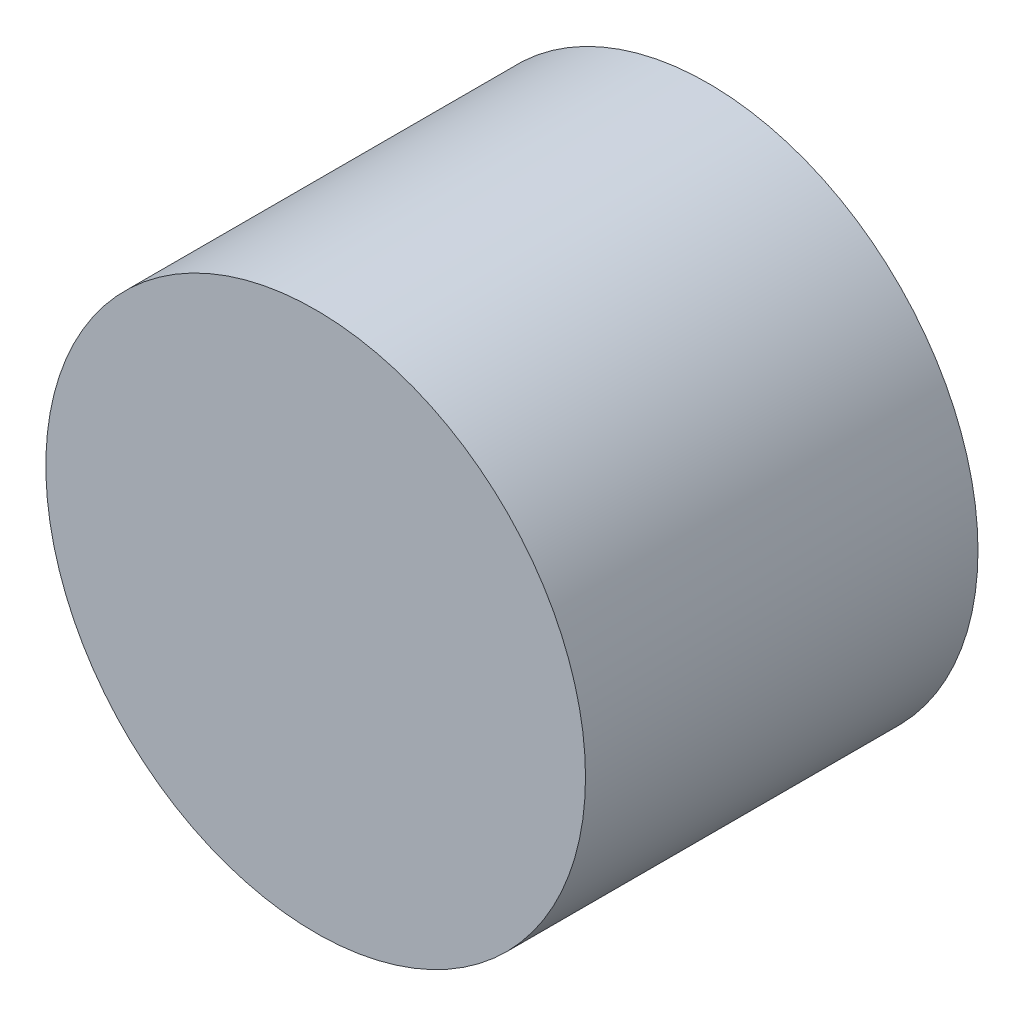
ISO-10303-21;
HEADER;
FILE_DESCRIPTION(('STEP AP214'),'2;1');
FILE_NAME('part.step','',(''),(''),'','','');
FILE_SCHEMA(('AUTOMOTIVE_DESIGN { 1 0 10303 214 1 1 1 1 }'));
ENDSEC;
DATA;
#1=APPLICATION_CONTEXT('core data for automotive mechanical design processes');
#2=APPLICATION_PROTOCOL_DEFINITION('international standard','automotive_design',2000,#1);
#3=PRODUCT_CONTEXT('',#1,'mechanical');
#4=PRODUCT('Part','Part','',(#3));
#5=PRODUCT_RELATED_PRODUCT_CATEGORY('part','',(#4));
#6=PRODUCT_DEFINITION_FORMATION('','',#4);
#7=PRODUCT_DEFINITION_CONTEXT('part definition',#1,'design');
#8=PRODUCT_DEFINITION('design','',#6,#7);
#9=PRODUCT_DEFINITION_SHAPE('','',#8);
#10=(LENGTH_UNIT() NAMED_UNIT(*) SI_UNIT(.MILLI.,.METRE.));
#11=(NAMED_UNIT(*) PLANE_ANGLE_UNIT() SI_UNIT($,.RADIAN.));
#12=(NAMED_UNIT(*) SI_UNIT($,.STERADIAN.) SOLID_ANGLE_UNIT());
#13=UNCERTAINTY_MEASURE_WITH_UNIT(LENGTH_MEASURE(1.E-05),#10,'distance_accuracy_value','');
#14=(GEOMETRIC_REPRESENTATION_CONTEXT(3) GLOBAL_UNCERTAINTY_ASSIGNED_CONTEXT((#13)) GLOBAL_UNIT_ASSIGNED_CONTEXT((#10,
#11,#12)) REPRESENTATION_CONTEXT('',''));
#15=CARTESIAN_POINT('',(0.,0.,0.));
#16=DIRECTION('',(0.,0.,1.));
#17=DIRECTION('',(1.,0.,0.));
#18=AXIS2_PLACEMENT_3D('',#15,#16,#17);
#19=CARTESIAN_POINT('',(0.,0.,8.));
#20=DIRECTION('',(0.,0.,-1.));
#21=DIRECTION('',(-1.,0.,0.));
#22=AXIS2_PLACEMENT_3D('',#19,#20,#21);
#23=CYLINDRICAL_SURFACE('',#22,5.5);
#24=CARTESIAN_POINT('',(0.,0.,8.));
#25=DIRECTION('',(0.,0.,1.));
#26=DIRECTION('',(1.,0.,0.));
#27=AXIS2_PLACEMENT_3D('',#24,#25,#26);
#28=CIRCLE('',#27,5.5);
#29=CARTESIAN_POINT('',(5.5,0.,8.));
#30=VERTEX_POINT('',#29);
#31=EDGE_CURVE('E10',#30,#30,#28,.T.);
#32=ORIENTED_EDGE('',*,*,#31,.F.);
#33=EDGE_LOOP('',(#32));
#34=FACE_BOUND('',#33,.T.);
#35=CARTESIAN_POINT('',(0.,0.,0.));
#36=DIRECTION('',(0.,0.,1.));
#37=DIRECTION('',(1.,0.,0.));
#38=AXIS2_PLACEMENT_3D('',#35,#36,#37);
#39=CIRCLE('',#38,5.5);
#40=CARTESIAN_POINT('',(5.5,0.,0.));
#41=VERTEX_POINT('',#40);
#42=EDGE_CURVE('E36',#41,#41,#39,.T.);
#43=ORIENTED_EDGE('',*,*,#42,.T.);
#44=EDGE_LOOP('',(#43));
#45=FACE_BOUND('',#44,.T.);
#46=ADVANCED_FACE('F33',(#34,#45),#23,.T.);
#47=CARTESIAN_POINT('',(0.,0.,8.));
#48=DIRECTION('',(0.,0.,1.));
#49=DIRECTION('',(1.,0.,0.));
#50=AXIS2_PLACEMENT_3D('',#47,#48,#49);
#51=PLANE('',#50);
#52=ORIENTED_EDGE('',*,*,#31,.T.);
#53=EDGE_LOOP('',(#52));
#54=FACE_BOUND('',#53,.T.);
#55=ADVANCED_FACE('F48',(#54),#51,.T.);
#56=CARTESIAN_POINT('',(0.,0.,0.));
#57=DIRECTION('',(0.,0.,1.));
#58=DIRECTION('',(1.,0.,0.));
#59=AXIS2_PLACEMENT_3D('',#56,#57,#58);
#60=PLANE('',#59);
#61=ORIENTED_EDGE('',*,*,#42,.F.);
#62=EDGE_LOOP('',(#61));
#63=FACE_BOUND('',#62,.T.);
#64=ADVANCED_FACE('F46',(#63),#60,.F.);
#65=CLOSED_SHELL('',(#46,#55,#64));
#66=MANIFOLD_SOLID_BREP('B2',#65);
#67=ADVANCED_BREP_SHAPE_REPRESENTATION('',(#18,#66),#14);
#68=SHAPE_DEFINITION_REPRESENTATION(#9,#67);
ENDSEC;
END-ISO-10303-21;
